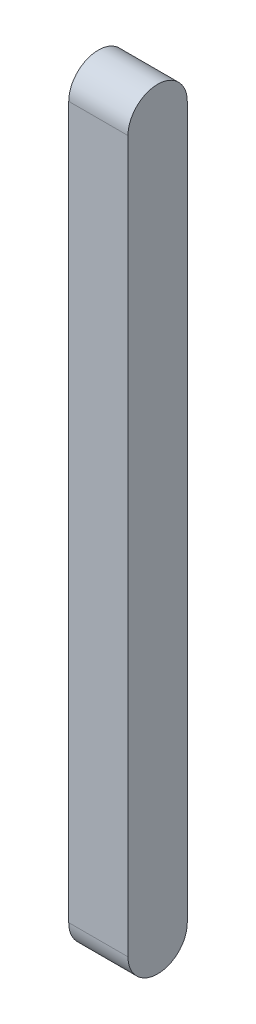
ISO-10303-21;
HEADER;
FILE_DESCRIPTION(('STEP AP214'),'2;1');
FILE_NAME('part.step','',(''),(''),'','','');
FILE_SCHEMA(('AUTOMOTIVE_DESIGN { 1 0 10303 214 1 1 1 1 }'));
ENDSEC;
DATA;
#1=APPLICATION_CONTEXT('core data for automotive mechanical design processes');
#2=APPLICATION_PROTOCOL_DEFINITION('international standard','automotive_design',2000,#1);
#3=PRODUCT_CONTEXT('',#1,'mechanical');
#4=PRODUCT('Part','Part','',(#3));
#5=PRODUCT_RELATED_PRODUCT_CATEGORY('part','',(#4));
#6=PRODUCT_DEFINITION_FORMATION('','',#4);
#7=PRODUCT_DEFINITION_CONTEXT('part definition',#1,'design');
#8=PRODUCT_DEFINITION('design','',#6,#7);
#9=PRODUCT_DEFINITION_SHAPE('','',#8);
#10=(LENGTH_UNIT() NAMED_UNIT(*) SI_UNIT(.MILLI.,.METRE.));
#11=(NAMED_UNIT(*) PLANE_ANGLE_UNIT() SI_UNIT($,.RADIAN.));
#12=(NAMED_UNIT(*) SI_UNIT($,.STERADIAN.) SOLID_ANGLE_UNIT());
#13=UNCERTAINTY_MEASURE_WITH_UNIT(LENGTH_MEASURE(1.E-05),#10,'distance_accuracy_value','');
#14=(GEOMETRIC_REPRESENTATION_CONTEXT(3) GLOBAL_UNCERTAINTY_ASSIGNED_CONTEXT((#13)) GLOBAL_UNIT_ASSIGNED_CONTEXT((#10,
#11,#12)) REPRESENTATION_CONTEXT('',''));
#15=CARTESIAN_POINT('',(0.,0.,0.));
#16=DIRECTION('',(0.,0.,1.));
#17=DIRECTION('',(1.,0.,0.));
#18=AXIS2_PLACEMENT_3D('',#15,#16,#17);
#19=CARTESIAN_POINT('',(0.,0.,0.));
#20=DIRECTION('',(1.,0.,0.));
#21=DIRECTION('',(0.,0.,-1.));
#22=AXIS2_PLACEMENT_3D('',#19,#20,#21);
#23=PLANE('',#22);
#24=CARTESIAN_POINT('',(0.,-60.,0.));
#25=DIRECTION('',(1.,0.,0.));
#26=DIRECTION('',(0.,0.,-1.));
#27=AXIS2_PLACEMENT_3D('',#24,#25,#26);
#28=CIRCLE('',#27,5.);
#29=CARTESIAN_POINT('',(0.,-60.,4.99999999999999));
#30=VERTEX_POINT('',#29);
#31=CARTESIAN_POINT('',(0.,-60.,-5.00000000000001));
#32=VERTEX_POINT('',#31);
#33=EDGE_CURVE('E163',#30,#32,#28,.T.);
#34=ORIENTED_EDGE('',*,*,#33,.F.);
#35=DIRECTION('',(0.,-1.,0.));
#36=VECTOR('',#35,1.);
#37=CARTESIAN_POINT('',(0.,60.,5.00000000000001));
#38=LINE('',#37,#36);
#39=CARTESIAN_POINT('',(0.,60.,5.00000000000001));
#40=VERTEX_POINT('',#39);
#41=EDGE_CURVE('E101',#40,#30,#38,.T.);
#42=ORIENTED_EDGE('',*,*,#41,.F.);
#43=CARTESIAN_POINT('',(0.,60.,0.));
#44=DIRECTION('',(1.,0.,0.));
#45=DIRECTION('',(0.,0.,-1.));
#46=AXIS2_PLACEMENT_3D('',#43,#44,#45);
#47=CIRCLE('',#46,5.);
#48=CARTESIAN_POINT('',(0.,60.,-4.99999999999999));
#49=VERTEX_POINT('',#48);
#50=EDGE_CURVE('E145',#49,#40,#47,.T.);
#51=ORIENTED_EDGE('',*,*,#50,.F.);
#52=DIRECTION('',(0.,-1.,0.));
#53=VECTOR('',#52,1.);
#54=CARTESIAN_POINT('',(0.,60.,-4.99999999999999));
#55=LINE('',#54,#53);
#56=EDGE_CURVE('E164',#49,#32,#55,.T.);
#57=ORIENTED_EDGE('',*,*,#56,.T.);
#58=EDGE_LOOP('',(#34,#42,#51,#57));
#59=FACE_BOUND('',#58,.T.);
#60=ADVANCED_FACE('F97',(#59),#23,.F.);
#61=CARTESIAN_POINT('',(10.,-60.,0.));
#62=DIRECTION('',(-1.,0.,0.));
#63=DIRECTION('',(0.,0.,1.));
#64=AXIS2_PLACEMENT_3D('',#61,#62,#63);
#65=CYLINDRICAL_SURFACE('',#64,5.);
#66=ORIENTED_EDGE('',*,*,#33,.T.);
#67=DIRECTION('',(-1.,0.,0.));
#68=VECTOR('',#67,1.);
#69=CARTESIAN_POINT('',(10.,-60.,-5.00000000000001));
#70=LINE('',#69,#68);
#71=CARTESIAN_POINT('',(10.,-60.,-5.00000000000001));
#72=VERTEX_POINT('',#71);
#73=EDGE_CURVE('E107',#72,#32,#70,.T.);
#74=ORIENTED_EDGE('',*,*,#73,.F.);
#75=CARTESIAN_POINT('',(10.,-60.,0.));
#76=DIRECTION('',(1.,0.,0.));
#77=DIRECTION('',(0.,0.,-1.));
#78=AXIS2_PLACEMENT_3D('',#75,#76,#77);
#79=CIRCLE('',#78,5.);
#80=CARTESIAN_POINT('',(10.,-60.,4.99999999999999));
#81=VERTEX_POINT('',#80);
#82=EDGE_CURVE('E168',#81,#72,#79,.T.);
#83=ORIENTED_EDGE('',*,*,#82,.F.);
#84=DIRECTION('',(-1.,0.,0.));
#85=VECTOR('',#84,1.);
#86=CARTESIAN_POINT('',(10.,-60.,4.99999999999999));
#87=LINE('',#86,#85);
#88=EDGE_CURVE('E12',#81,#30,#87,.T.);
#89=ORIENTED_EDGE('',*,*,#88,.T.);
#90=EDGE_LOOP('',(#66,#74,#83,#89));
#91=FACE_BOUND('',#90,.T.);
#92=ADVANCED_FACE('F171',(#91),#65,.T.);
#93=CARTESIAN_POINT('',(10.,0.,0.));
#94=DIRECTION('',(1.,0.,0.));
#95=DIRECTION('',(0.,0.,-1.));
#96=AXIS2_PLACEMENT_3D('',#93,#94,#95);
#97=PLANE('',#96);
#98=ORIENTED_EDGE('',*,*,#82,.T.);
#99=DIRECTION('',(0.,-1.,0.));
#100=VECTOR('',#99,1.);
#101=CARTESIAN_POINT('',(10.,60.,-4.99999999999999));
#102=LINE('',#101,#100);
#103=CARTESIAN_POINT('',(10.,60.,-4.99999999999999));
#104=VERTEX_POINT('',#103);
#105=EDGE_CURVE('E155',#104,#72,#102,.T.);
#106=ORIENTED_EDGE('',*,*,#105,.F.);
#107=CARTESIAN_POINT('',(10.,60.,0.));
#108=DIRECTION('',(1.,0.,0.));
#109=DIRECTION('',(0.,0.,-1.));
#110=AXIS2_PLACEMENT_3D('',#107,#108,#109);
#111=CIRCLE('',#110,5.);
#112=CARTESIAN_POINT('',(10.,60.,5.00000000000001));
#113=VERTEX_POINT('',#112);
#114=EDGE_CURVE('E143',#104,#113,#111,.T.);
#115=ORIENTED_EDGE('',*,*,#114,.T.);
#116=DIRECTION('',(0.,-1.,0.));
#117=VECTOR('',#116,1.);
#118=CARTESIAN_POINT('',(10.,60.,5.00000000000001));
#119=LINE('',#118,#117);
#120=EDGE_CURVE('E151',#113,#81,#119,.T.);
#121=ORIENTED_EDGE('',*,*,#120,.T.);
#122=EDGE_LOOP('',(#98,#106,#115,#121));
#123=FACE_BOUND('',#122,.T.);
#124=ADVANCED_FACE('F157',(#123),#97,.T.);
#125=CARTESIAN_POINT('',(10.,60.,0.));
#126=DIRECTION('',(-1.,0.,0.));
#127=DIRECTION('',(0.,0.,1.));
#128=AXIS2_PLACEMENT_3D('',#125,#126,#127);
#129=CYLINDRICAL_SURFACE('',#128,5.);
#130=ORIENTED_EDGE('',*,*,#114,.F.);
#131=DIRECTION('',(-1.,0.,0.));
#132=VECTOR('',#131,1.);
#133=CARTESIAN_POINT('',(10.,60.,-4.99999999999999));
#134=LINE('',#133,#132);
#135=EDGE_CURVE('E133',#104,#49,#134,.T.);
#136=ORIENTED_EDGE('',*,*,#135,.T.);
#137=ORIENTED_EDGE('',*,*,#50,.T.);
#138=DIRECTION('',(-1.,0.,0.));
#139=VECTOR('',#138,1.);
#140=CARTESIAN_POINT('',(10.,60.,5.00000000000001));
#141=LINE('',#140,#139);
#142=EDGE_CURVE('E139',#113,#40,#141,.T.);
#143=ORIENTED_EDGE('',*,*,#142,.F.);
#144=EDGE_LOOP('',(#130,#136,#137,#143));
#145=FACE_BOUND('',#144,.T.);
#146=ADVANCED_FACE('F141',(#145),#129,.T.);
#147=CARTESIAN_POINT('',(10.,60.,5.00000000000001));
#148=DIRECTION('',(0.,0.,-1.));
#149=DIRECTION('',(0.,1.,0.));
#150=AXIS2_PLACEMENT_3D('',#147,#148,#149);
#151=PLANE('',#150);
#152=ORIENTED_EDGE('',*,*,#41,.T.);
#153=ORIENTED_EDGE('',*,*,#88,.F.);
#154=ORIENTED_EDGE('',*,*,#120,.F.);
#155=ORIENTED_EDGE('',*,*,#142,.T.);
#156=EDGE_LOOP('',(#152,#153,#154,#155));
#157=FACE_BOUND('',#156,.T.);
#158=ADVANCED_FACE('F152',(#157),#151,.F.);
#159=CARTESIAN_POINT('',(10.,60.,-4.99999999999999));
#160=DIRECTION('',(0.,0.,-1.));
#161=DIRECTION('',(0.,1.,0.));
#162=AXIS2_PLACEMENT_3D('',#159,#160,#161);
#163=PLANE('',#162);
#164=ORIENTED_EDGE('',*,*,#56,.F.);
#165=ORIENTED_EDGE('',*,*,#135,.F.);
#166=ORIENTED_EDGE('',*,*,#105,.T.);
#167=ORIENTED_EDGE('',*,*,#73,.T.);
#168=EDGE_LOOP('',(#164,#165,#166,#167));
#169=FACE_BOUND('',#168,.T.);
#170=ADVANCED_FACE('F99',(#169),#163,.T.);
#171=CLOSED_SHELL('',(#60,#92,#124,#146,#158,#170));
#172=MANIFOLD_SOLID_BREP('B2',#171);
#173=ADVANCED_BREP_SHAPE_REPRESENTATION('',(#18,#172),#14);
#174=SHAPE_DEFINITION_REPRESENTATION(#9,#173);
ENDSEC;
END-ISO-10303-21;
